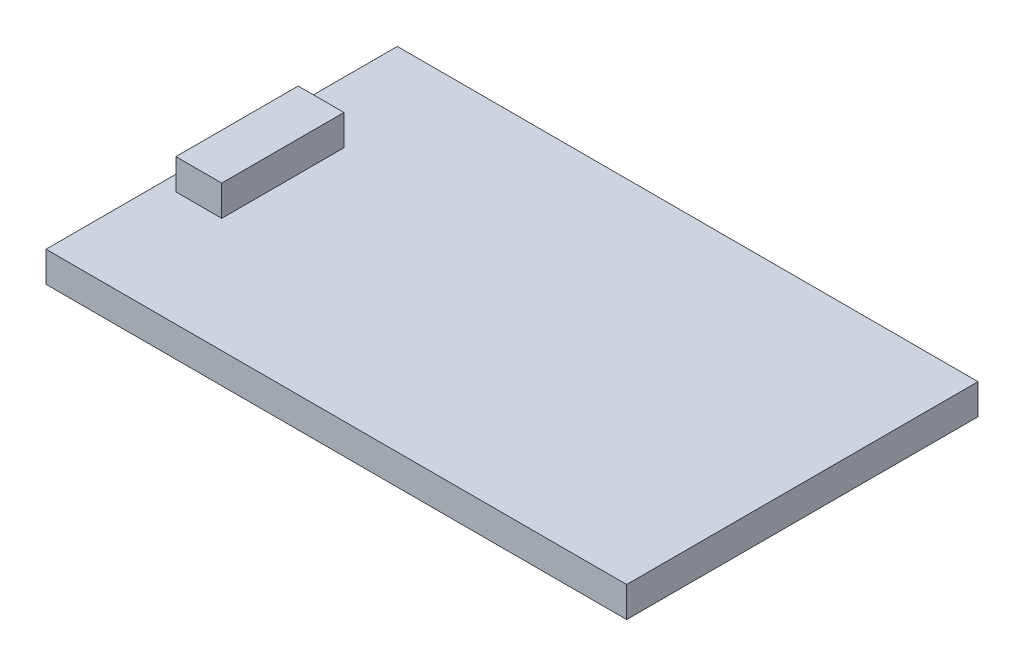
ISO-10303-21;
HEADER;
FILE_DESCRIPTION(('STEP AP214'),'2;1');
FILE_NAME('part.step','',(''),(''),'','','');
FILE_SCHEMA(('AUTOMOTIVE_DESIGN { 1 0 10303 214 1 1 1 1 }'));
ENDSEC;
DATA;
#1=APPLICATION_CONTEXT('core data for automotive mechanical design processes');
#2=APPLICATION_PROTOCOL_DEFINITION('international standard','automotive_design',2000,#1);
#3=PRODUCT_CONTEXT('',#1,'mechanical');
#4=PRODUCT('Part','Part','',(#3));
#5=PRODUCT_RELATED_PRODUCT_CATEGORY('part','',(#4));
#6=PRODUCT_DEFINITION_FORMATION('','',#4);
#7=PRODUCT_DEFINITION_CONTEXT('part definition',#1,'design');
#8=PRODUCT_DEFINITION('design','',#6,#7);
#9=PRODUCT_DEFINITION_SHAPE('','',#8);
#10=(LENGTH_UNIT() NAMED_UNIT(*) SI_UNIT(.MILLI.,.METRE.));
#11=(NAMED_UNIT(*) PLANE_ANGLE_UNIT() SI_UNIT($,.RADIAN.));
#12=(NAMED_UNIT(*) SI_UNIT($,.STERADIAN.) SOLID_ANGLE_UNIT());
#13=UNCERTAINTY_MEASURE_WITH_UNIT(LENGTH_MEASURE(1.E-05),#10,'distance_accuracy_value','');
#14=(GEOMETRIC_REPRESENTATION_CONTEXT(3) GLOBAL_UNCERTAINTY_ASSIGNED_CONTEXT((#13)) GLOBAL_UNIT_ASSIGNED_CONTEXT((#10,
#11,#12)) REPRESENTATION_CONTEXT('',''));
#15=CARTESIAN_POINT('',(0.,0.,0.));
#16=DIRECTION('',(0.,0.,1.));
#17=DIRECTION('',(1.,0.,0.));
#18=AXIS2_PLACEMENT_3D('',#15,#16,#17);
#19=CARTESIAN_POINT('',(0.,1.99,0.));
#20=DIRECTION('',(0.,-1.,0.));
#21=DIRECTION('',(0.,0.,-1.));
#22=AXIS2_PLACEMENT_3D('',#19,#20,#21);
#23=PLANE('',#22);
#24=DIRECTION('',(0.,0.,-1.));
#25=VECTOR('',#24,1.);
#26=CARTESIAN_POINT('',(19.,1.99,11.495));
#27=LINE('',#26,#25);
#28=CARTESIAN_POINT('',(19.,1.99,11.495));
#29=VERTEX_POINT('',#28);
#30=CARTESIAN_POINT('',(19.,1.99,-11.495));
#31=VERTEX_POINT('',#30);
#32=EDGE_CURVE('E138',#29,#31,#27,.T.);
#33=ORIENTED_EDGE('',*,*,#32,.T.);
#34=DIRECTION('',(-1.,0.,0.));
#35=VECTOR('',#34,1.);
#36=CARTESIAN_POINT('',(-19.,1.99,-11.495));
#37=LINE('',#36,#35);
#38=CARTESIAN_POINT('',(-19.,1.99,-11.495));
#39=VERTEX_POINT('',#38);
#40=EDGE_CURVE('E141',#31,#39,#37,.T.);
#41=ORIENTED_EDGE('',*,*,#40,.T.);
#42=DIRECTION('',(0.,0.,1.));
#43=VECTOR('',#42,1.);
#44=CARTESIAN_POINT('',(-19.,1.99,11.495));
#45=LINE('',#44,#43);
#46=CARTESIAN_POINT('',(-19.,1.99,11.495));
#47=VERTEX_POINT('',#46);
#48=EDGE_CURVE('E143',#39,#47,#45,.T.);
#49=ORIENTED_EDGE('',*,*,#48,.T.);
#50=DIRECTION('',(1.,0.,0.));
#51=VECTOR('',#50,1.);
#52=CARTESIAN_POINT('',(-19.,1.99,11.495));
#53=LINE('',#52,#51);
#54=EDGE_CURVE('E147',#47,#29,#53,.T.);
#55=ORIENTED_EDGE('',*,*,#54,.T.);
#56=EDGE_LOOP('',(#33,#41,#49,#55));
#57=FACE_BOUND('',#56,.T.);
#58=DIRECTION('',(0.,0.,1.));
#59=VECTOR('',#58,1.);
#60=CARTESIAN_POINT('',(-18.,1.99,-4.005));
#61=LINE('',#60,#59);
#62=CARTESIAN_POINT('',(-18.,1.99,-4.005));
#63=VERTEX_POINT('',#62);
#64=CARTESIAN_POINT('',(-18.,1.99,3.995));
#65=VERTEX_POINT('',#64);
#66=EDGE_CURVE('E56',#63,#65,#61,.T.);
#67=ORIENTED_EDGE('',*,*,#66,.F.);
#68=DIRECTION('',(-1.,0.,0.));
#69=VECTOR('',#68,1.);
#70=CARTESIAN_POINT('',(-18.,1.99,-4.005));
#71=LINE('',#70,#69);
#72=CARTESIAN_POINT('',(-15.,1.99,-4.005));
#73=VERTEX_POINT('',#72);
#74=EDGE_CURVE('E63',#73,#63,#71,.T.);
#75=ORIENTED_EDGE('',*,*,#74,.F.);
#76=DIRECTION('',(0.,0.,-1.));
#77=VECTOR('',#76,1.);
#78=CARTESIAN_POINT('',(-15.,1.99,-4.005));
#79=LINE('',#78,#77);
#80=CARTESIAN_POINT('',(-15.,1.99,3.995));
#81=VERTEX_POINT('',#80);
#82=EDGE_CURVE('E258',#81,#73,#79,.T.);
#83=ORIENTED_EDGE('',*,*,#82,.F.);
#84=DIRECTION('',(1.,0.,0.));
#85=VECTOR('',#84,1.);
#86=CARTESIAN_POINT('',(-18.,1.99,3.995));
#87=LINE('',#86,#85);
#88=EDGE_CURVE('E265',#65,#81,#87,.T.);
#89=ORIENTED_EDGE('',*,*,#88,.F.);
#90=EDGE_LOOP('',(#67,#75,#83,#89));
#91=FACE_BOUND('',#90,.T.);
#92=ADVANCED_FACE('F42',(#57,#91),#23,.F.);
#93=CARTESIAN_POINT('',(19.,1.99,11.495));
#94=DIRECTION('',(-1.,0.,0.));
#95=DIRECTION('',(0.,0.,1.));
#96=AXIS2_PLACEMENT_3D('',#93,#94,#95);
#97=PLANE('',#96);
#98=DIRECTION('',(0.,0.,-1.));
#99=VECTOR('',#98,1.);
#100=CARTESIAN_POINT('',(19.,0.,11.495));
#101=LINE('',#100,#99);
#102=CARTESIAN_POINT('',(19.,0.,11.495));
#103=VERTEX_POINT('',#102);
#104=CARTESIAN_POINT('',(19.,0.,-11.495));
#105=VERTEX_POINT('',#104);
#106=EDGE_CURVE('E129',#103,#105,#101,.T.);
#107=ORIENTED_EDGE('',*,*,#106,.T.);
#108=DIRECTION('',(0.,-1.,0.));
#109=VECTOR('',#108,1.);
#110=CARTESIAN_POINT('',(19.,1.99,-11.495));
#111=LINE('',#110,#109);
#112=EDGE_CURVE('E11',#31,#105,#111,.T.);
#113=ORIENTED_EDGE('',*,*,#112,.F.);
#114=ORIENTED_EDGE('',*,*,#32,.F.);
#115=DIRECTION('',(0.,-1.,0.));
#116=VECTOR('',#115,1.);
#117=CARTESIAN_POINT('',(19.,1.99,11.495));
#118=LINE('',#117,#116);
#119=EDGE_CURVE('E150',#29,#103,#118,.T.);
#120=ORIENTED_EDGE('',*,*,#119,.T.);
#121=EDGE_LOOP('',(#107,#113,#114,#120));
#122=FACE_BOUND('',#121,.T.);
#123=ADVANCED_FACE('F46',(#122),#97,.F.);
#124=CARTESIAN_POINT('',(-19.,1.99,-11.495));
#125=DIRECTION('',(0.,0.,1.));
#126=DIRECTION('',(1.,0.,0.));
#127=AXIS2_PLACEMENT_3D('',#124,#125,#126);
#128=PLANE('',#127);
#129=DIRECTION('',(-1.,0.,0.));
#130=VECTOR('',#129,1.);
#131=CARTESIAN_POINT('',(-19.,0.,-11.495));
#132=LINE('',#131,#130);
#133=CARTESIAN_POINT('',(-19.,0.,-11.495));
#134=VERTEX_POINT('',#133);
#135=EDGE_CURVE('E135',#105,#134,#132,.T.);
#136=ORIENTED_EDGE('',*,*,#135,.T.);
#137=DIRECTION('',(0.,-1.,0.));
#138=VECTOR('',#137,1.);
#139=CARTESIAN_POINT('',(-19.,1.99,-11.495));
#140=LINE('',#139,#138);
#141=EDGE_CURVE('E55',#39,#134,#140,.T.);
#142=ORIENTED_EDGE('',*,*,#141,.F.);
#143=ORIENTED_EDGE('',*,*,#40,.F.);
#144=ORIENTED_EDGE('',*,*,#112,.T.);
#145=EDGE_LOOP('',(#136,#142,#143,#144));
#146=FACE_BOUND('',#145,.T.);
#147=ADVANCED_FACE('F180',(#146),#128,.F.);
#148=CARTESIAN_POINT('',(-19.,1.99,11.495));
#149=DIRECTION('',(1.,0.,0.));
#150=DIRECTION('',(0.,0.,-1.));
#151=AXIS2_PLACEMENT_3D('',#148,#149,#150);
#152=PLANE('',#151);
#153=DIRECTION('',(0.,0.,1.));
#154=VECTOR('',#153,1.);
#155=CARTESIAN_POINT('',(-19.,0.,11.495));
#156=LINE('',#155,#154);
#157=CARTESIAN_POINT('',(-19.,0.,11.495));
#158=VERTEX_POINT('',#157);
#159=EDGE_CURVE('E148',#134,#158,#156,.T.);
#160=ORIENTED_EDGE('',*,*,#159,.T.);
#161=DIRECTION('',(0.,-1.,0.));
#162=VECTOR('',#161,1.);
#163=CARTESIAN_POINT('',(-19.,1.99,11.495));
#164=LINE('',#163,#162);
#165=EDGE_CURVE('E151',#47,#158,#164,.T.);
#166=ORIENTED_EDGE('',*,*,#165,.F.);
#167=ORIENTED_EDGE('',*,*,#48,.F.);
#168=ORIENTED_EDGE('',*,*,#141,.T.);
#169=EDGE_LOOP('',(#160,#166,#167,#168));
#170=FACE_BOUND('',#169,.T.);
#171=ADVANCED_FACE('F165',(#170),#152,.F.);
#172=CARTESIAN_POINT('',(-19.,1.99,11.495));
#173=DIRECTION('',(0.,0.,-1.));
#174=DIRECTION('',(-1.,0.,0.));
#175=AXIS2_PLACEMENT_3D('',#172,#173,#174);
#176=PLANE('',#175);
#177=DIRECTION('',(1.,0.,0.));
#178=VECTOR('',#177,1.);
#179=CARTESIAN_POINT('',(-19.,0.,11.495));
#180=LINE('',#179,#178);
#181=EDGE_CURVE('E145',#158,#103,#180,.T.);
#182=ORIENTED_EDGE('',*,*,#181,.T.);
#183=ORIENTED_EDGE('',*,*,#119,.F.);
#184=ORIENTED_EDGE('',*,*,#54,.F.);
#185=ORIENTED_EDGE('',*,*,#165,.T.);
#186=EDGE_LOOP('',(#182,#183,#184,#185));
#187=FACE_BOUND('',#186,.T.);
#188=ADVANCED_FACE('F173',(#187),#176,.F.);
#189=CARTESIAN_POINT('',(0.,0.,0.));
#190=DIRECTION('',(0.,-1.,0.));
#191=DIRECTION('',(0.,0.,-1.));
#192=AXIS2_PLACEMENT_3D('',#189,#190,#191);
#193=PLANE('',#192);
#194=ORIENTED_EDGE('',*,*,#106,.F.);
#195=ORIENTED_EDGE('',*,*,#181,.F.);
#196=ORIENTED_EDGE('',*,*,#159,.F.);
#197=ORIENTED_EDGE('',*,*,#135,.F.);
#198=EDGE_LOOP('',(#194,#195,#196,#197));
#199=FACE_BOUND('',#198,.T.);
#200=ADVANCED_FACE('F166',(#199),#193,.T.);
#201=CARTESIAN_POINT('',(-18.,3.99,-4.005));
#202=DIRECTION('',(1.,0.,0.));
#203=DIRECTION('',(0.,0.,-1.));
#204=AXIS2_PLACEMENT_3D('',#201,#202,#203);
#205=PLANE('',#204);
#206=ORIENTED_EDGE('',*,*,#66,.T.);
#207=DIRECTION('',(0.,-1.,0.));
#208=VECTOR('',#207,1.);
#209=CARTESIAN_POINT('',(-18.,3.99,3.995));
#210=LINE('',#209,#208);
#211=CARTESIAN_POINT('',(-18.,3.99,3.995));
#212=VERTEX_POINT('',#211);
#213=EDGE_CURVE('E115',#212,#65,#210,.T.);
#214=ORIENTED_EDGE('',*,*,#213,.F.);
#215=DIRECTION('',(0.,0.,1.));
#216=VECTOR('',#215,1.);
#217=CARTESIAN_POINT('',(-18.,3.99,-4.005));
#218=LINE('',#217,#216);
#219=CARTESIAN_POINT('',(-18.,3.99,-4.005));
#220=VERTEX_POINT('',#219);
#221=EDGE_CURVE('E116',#220,#212,#218,.T.);
#222=ORIENTED_EDGE('',*,*,#221,.F.);
#223=DIRECTION('',(0.,-1.,0.));
#224=VECTOR('',#223,1.);
#225=CARTESIAN_POINT('',(-18.,3.99,-4.005));
#226=LINE('',#225,#224);
#227=EDGE_CURVE('E252',#220,#63,#226,.T.);
#228=ORIENTED_EDGE('',*,*,#227,.T.);
#229=EDGE_LOOP('',(#206,#214,#222,#228));
#230=FACE_BOUND('',#229,.T.);
#231=ADVANCED_FACE('F126',(#230),#205,.F.);
#232=CARTESIAN_POINT('',(-18.,3.99,3.995));
#233=DIRECTION('',(0.,0.,-1.));
#234=DIRECTION('',(-1.,0.,0.));
#235=AXIS2_PLACEMENT_3D('',#232,#233,#234);
#236=PLANE('',#235);
#237=ORIENTED_EDGE('',*,*,#88,.T.);
#238=DIRECTION('',(0.,-1.,0.));
#239=VECTOR('',#238,1.);
#240=CARTESIAN_POINT('',(-15.,3.99,3.995));
#241=LINE('',#240,#239);
#242=CARTESIAN_POINT('',(-15.,3.99,3.995));
#243=VERTEX_POINT('',#242);
#244=EDGE_CURVE('E114',#243,#81,#241,.T.);
#245=ORIENTED_EDGE('',*,*,#244,.F.);
#246=DIRECTION('',(1.,0.,0.));
#247=VECTOR('',#246,1.);
#248=CARTESIAN_POINT('',(-18.,3.99,3.995));
#249=LINE('',#248,#247);
#250=EDGE_CURVE('E110',#212,#243,#249,.T.);
#251=ORIENTED_EDGE('',*,*,#250,.F.);
#252=ORIENTED_EDGE('',*,*,#213,.T.);
#253=EDGE_LOOP('',(#237,#245,#251,#252));
#254=FACE_BOUND('',#253,.T.);
#255=ADVANCED_FACE('F106',(#254),#236,.F.);
#256=CARTESIAN_POINT('',(-15.,3.99,-4.005));
#257=DIRECTION('',(-1.,0.,0.));
#258=DIRECTION('',(0.,0.,1.));
#259=AXIS2_PLACEMENT_3D('',#256,#257,#258);
#260=PLANE('',#259);
#261=ORIENTED_EDGE('',*,*,#82,.T.);
#262=DIRECTION('',(0.,-1.,0.));
#263=VECTOR('',#262,1.);
#264=CARTESIAN_POINT('',(-15.,3.99,-4.005));
#265=LINE('',#264,#263);
#266=CARTESIAN_POINT('',(-15.,3.99,-4.005));
#267=VERTEX_POINT('',#266);
#268=EDGE_CURVE('E132',#267,#73,#265,.T.);
#269=ORIENTED_EDGE('',*,*,#268,.F.);
#270=DIRECTION('',(0.,0.,-1.));
#271=VECTOR('',#270,1.);
#272=CARTESIAN_POINT('',(-15.,3.99,-4.005));
#273=LINE('',#272,#271);
#274=EDGE_CURVE('E120',#243,#267,#273,.T.);
#275=ORIENTED_EDGE('',*,*,#274,.F.);
#276=ORIENTED_EDGE('',*,*,#244,.T.);
#277=EDGE_LOOP('',(#261,#269,#275,#276));
#278=FACE_BOUND('',#277,.T.);
#279=ADVANCED_FACE('F222',(#278),#260,.F.);
#280=CARTESIAN_POINT('',(-18.,3.99,-4.005));
#281=DIRECTION('',(0.,0.,1.));
#282=DIRECTION('',(1.,0.,0.));
#283=AXIS2_PLACEMENT_3D('',#280,#281,#282);
#284=PLANE('',#283);
#285=ORIENTED_EDGE('',*,*,#74,.T.);
#286=ORIENTED_EDGE('',*,*,#227,.F.);
#287=DIRECTION('',(-1.,0.,0.));
#288=VECTOR('',#287,1.);
#289=CARTESIAN_POINT('',(-18.,3.99,-4.005));
#290=LINE('',#289,#288);
#291=EDGE_CURVE('E121',#267,#220,#290,.T.);
#292=ORIENTED_EDGE('',*,*,#291,.F.);
#293=ORIENTED_EDGE('',*,*,#268,.T.);
#294=EDGE_LOOP('',(#285,#286,#292,#293));
#295=FACE_BOUND('',#294,.T.);
#296=ADVANCED_FACE('F235',(#295),#284,.F.);
#297=CARTESIAN_POINT('',(0.,3.99,0.));
#298=DIRECTION('',(0.,1.,0.));
#299=DIRECTION('',(0.,0.,1.));
#300=AXIS2_PLACEMENT_3D('',#297,#298,#299);
#301=PLANE('',#300);
#302=ORIENTED_EDGE('',*,*,#221,.T.);
#303=ORIENTED_EDGE('',*,*,#250,.T.);
#304=ORIENTED_EDGE('',*,*,#274,.T.);
#305=ORIENTED_EDGE('',*,*,#291,.T.);
#306=EDGE_LOOP('',(#302,#303,#304,#305));
#307=FACE_BOUND('',#306,.T.);
#308=ADVANCED_FACE('F123',(#307),#301,.T.);
#309=CLOSED_SHELL('',(#92,#123,#147,#171,#188,#200,#231,#255,#279,#296,#308));
#310=MANIFOLD_SOLID_BREP('B2',#309);
#311=ADVANCED_BREP_SHAPE_REPRESENTATION('',(#18,#310),#14);
#312=SHAPE_DEFINITION_REPRESENTATION(#9,#311);
ENDSEC;
END-ISO-10303-21;
